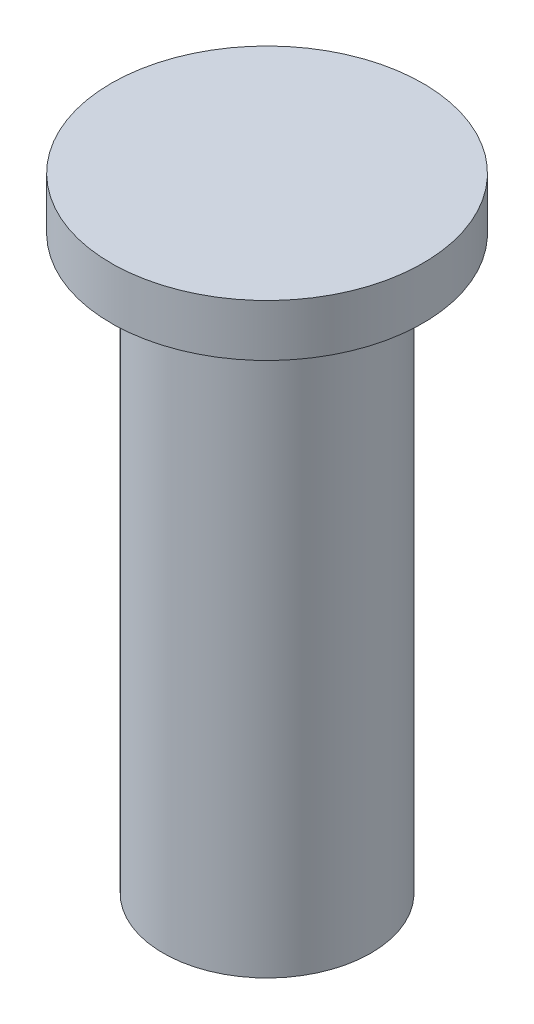
ISO-10303-21;
HEADER;
FILE_DESCRIPTION(('STEP AP214'),'2;1');
FILE_NAME('part.step','',(''),(''),'','','');
FILE_SCHEMA(('AUTOMOTIVE_DESIGN { 1 0 10303 214 1 1 1 1 }'));
ENDSEC;
DATA;
#1=APPLICATION_CONTEXT('core data for automotive mechanical design processes');
#2=APPLICATION_PROTOCOL_DEFINITION('international standard','automotive_design',2000,#1);
#3=PRODUCT_CONTEXT('',#1,'mechanical');
#4=PRODUCT('Part','Part','',(#3));
#5=PRODUCT_RELATED_PRODUCT_CATEGORY('part','',(#4));
#6=PRODUCT_DEFINITION_FORMATION('','',#4);
#7=PRODUCT_DEFINITION_CONTEXT('part definition',#1,'design');
#8=PRODUCT_DEFINITION('design','',#6,#7);
#9=PRODUCT_DEFINITION_SHAPE('','',#8);
#10=(LENGTH_UNIT() NAMED_UNIT(*) SI_UNIT(.MILLI.,.METRE.));
#11=(NAMED_UNIT(*) PLANE_ANGLE_UNIT() SI_UNIT($,.RADIAN.));
#12=(NAMED_UNIT(*) SI_UNIT($,.STERADIAN.) SOLID_ANGLE_UNIT());
#13=UNCERTAINTY_MEASURE_WITH_UNIT(LENGTH_MEASURE(1.E-05),#10,'distance_accuracy_value','');
#14=(GEOMETRIC_REPRESENTATION_CONTEXT(3) GLOBAL_UNCERTAINTY_ASSIGNED_CONTEXT((#13)) GLOBAL_UNIT_ASSIGNED_CONTEXT((#10,
#11,#12)) REPRESENTATION_CONTEXT('',''));
#15=CARTESIAN_POINT('',(0.,0.,0.));
#16=DIRECTION('',(0.,0.,1.));
#17=DIRECTION('',(1.,0.,0.));
#18=AXIS2_PLACEMENT_3D('',#15,#16,#17);
#19=CARTESIAN_POINT('',(0.,0.,0.));
#20=DIRECTION('',(0.,1.,0.));
#21=DIRECTION('',(-1.,0.,0.));
#22=AXIS2_PLACEMENT_3D('',#19,#20,#21);
#23=PLANE('',#22);
#24=CARTESIAN_POINT('',(0.,0.,0.));
#25=DIRECTION('',(0.,1.,0.));
#26=DIRECTION('',(-1.,0.,0.));
#27=AXIS2_PLACEMENT_3D('',#24,#25,#26);
#28=CIRCLE('',#27,2.);
#29=CARTESIAN_POINT('',(-2.,0.,0.));
#30=VERTEX_POINT('',#29);
#31=EDGE_CURVE('E10',#30,#30,#28,.T.);
#32=ORIENTED_EDGE('',*,*,#31,.F.);
#33=EDGE_LOOP('',(#32));
#34=FACE_BOUND('',#33,.T.);
#35=ADVANCED_FACE('F41',(#34),#23,.F.);
#36=CARTESIAN_POINT('',(0.,12.,0.));
#37=DIRECTION('',(0.,1.,0.));
#38=DIRECTION('',(-1.,0.,0.));
#39=AXIS2_PLACEMENT_3D('',#36,#37,#38);
#40=CYLINDRICAL_SURFACE('',#39,2.);
#41=CARTESIAN_POINT('',(0.,11.,0.));
#42=DIRECTION('',(0.,1.,0.));
#43=DIRECTION('',(-1.,0.,0.));
#44=AXIS2_PLACEMENT_3D('',#41,#42,#43);
#45=CIRCLE('',#44,2.);
#46=CARTESIAN_POINT('',(-2.,11.,0.));
#47=VERTEX_POINT('',#46);
#48=EDGE_CURVE('E48',#47,#47,#45,.T.);
#49=ORIENTED_EDGE('',*,*,#48,.F.);
#50=EDGE_LOOP('',(#49));
#51=FACE_BOUND('',#50,.T.);
#52=ORIENTED_EDGE('',*,*,#31,.T.);
#53=EDGE_LOOP('',(#52));
#54=FACE_BOUND('',#53,.T.);
#55=ADVANCED_FACE('F75',(#51,#54),#40,.T.);
#56=CARTESIAN_POINT('',(2.,11.,0.));
#57=DIRECTION('',(0.,1.,0.));
#58=DIRECTION('',(-1.,0.,0.));
#59=AXIS2_PLACEMENT_3D('',#56,#57,#58);
#60=PLANE('',#59);
#61=CARTESIAN_POINT('',(0.,11.,0.));
#62=DIRECTION('',(0.,1.,0.));
#63=DIRECTION('',(-1.,0.,0.));
#64=AXIS2_PLACEMENT_3D('',#61,#62,#63);
#65=CIRCLE('',#64,3.);
#66=CARTESIAN_POINT('',(-3.,11.,0.));
#67=VERTEX_POINT('',#66);
#68=EDGE_CURVE('E53',#67,#67,#65,.T.);
#69=ORIENTED_EDGE('',*,*,#68,.F.);
#70=EDGE_LOOP('',(#69));
#71=FACE_BOUND('',#70,.T.);
#72=ORIENTED_EDGE('',*,*,#48,.T.);
#73=EDGE_LOOP('',(#72));
#74=FACE_BOUND('',#73,.T.);
#75=ADVANCED_FACE('F70',(#71,#74),#60,.F.);
#76=CARTESIAN_POINT('',(0.,12.,0.));
#77=DIRECTION('',(0.,1.,0.));
#78=DIRECTION('',(-1.,0.,0.));
#79=AXIS2_PLACEMENT_3D('',#76,#77,#78);
#80=CYLINDRICAL_SURFACE('',#79,3.);
#81=CARTESIAN_POINT('',(0.,12.,0.));
#82=DIRECTION('',(0.,1.,0.));
#83=DIRECTION('',(-1.,0.,0.));
#84=AXIS2_PLACEMENT_3D('',#81,#82,#83);
#85=CIRCLE('',#84,3.);
#86=CARTESIAN_POINT('',(-3.,12.,0.));
#87=VERTEX_POINT('',#86);
#88=EDGE_CURVE('E58',#87,#87,#85,.T.);
#89=ORIENTED_EDGE('',*,*,#88,.F.);
#90=EDGE_LOOP('',(#89));
#91=FACE_BOUND('',#90,.T.);
#92=ORIENTED_EDGE('',*,*,#68,.T.);
#93=EDGE_LOOP('',(#92));
#94=FACE_BOUND('',#93,.T.);
#95=ADVANCED_FACE('F67',(#91,#94),#80,.T.);
#96=CARTESIAN_POINT('',(3.,12.,0.));
#97=DIRECTION('',(0.,-1.,0.));
#98=DIRECTION('',(1.,0.,0.));
#99=AXIS2_PLACEMENT_3D('',#96,#97,#98);
#100=PLANE('',#99);
#101=ORIENTED_EDGE('',*,*,#88,.T.);
#102=EDGE_LOOP('',(#101));
#103=FACE_BOUND('',#102,.T.);
#104=ADVANCED_FACE('F65',(#103),#100,.F.);
#105=CLOSED_SHELL('',(#35,#55,#75,#95,#104));
#106=MANIFOLD_SOLID_BREP('B2',#105);
#107=ADVANCED_BREP_SHAPE_REPRESENTATION('',(#18,#106),#14);
#108=SHAPE_DEFINITION_REPRESENTATION(#9,#107);
ENDSEC;
END-ISO-10303-21;
